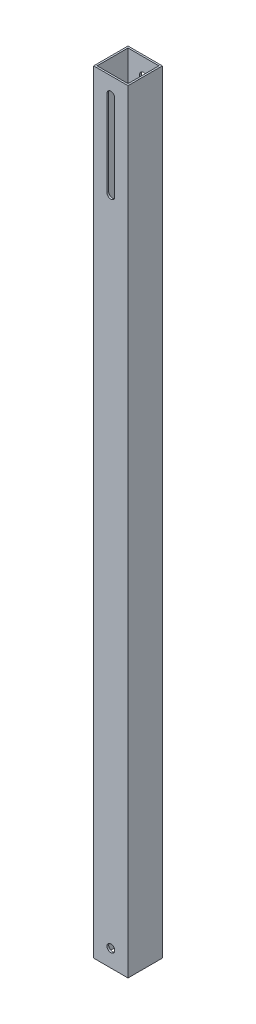
ISO-10303-21;
HEADER;
FILE_DESCRIPTION(('STEP AP214'),'2;1');
FILE_NAME('part.step','',(''),(''),'','','');
FILE_SCHEMA(('AUTOMOTIVE_DESIGN { 1 0 10303 214 1 1 1 1 }'));
ENDSEC;
DATA;
#1=APPLICATION_CONTEXT('core data for automotive mechanical design processes');
#2=APPLICATION_PROTOCOL_DEFINITION('international standard','automotive_design',2000,#1);
#3=PRODUCT_CONTEXT('',#1,'mechanical');
#4=PRODUCT('Part','Part','',(#3));
#5=PRODUCT_RELATED_PRODUCT_CATEGORY('part','',(#4));
#6=PRODUCT_DEFINITION_FORMATION('','',#4);
#7=PRODUCT_DEFINITION_CONTEXT('part definition',#1,'design');
#8=PRODUCT_DEFINITION('design','',#6,#7);
#9=PRODUCT_DEFINITION_SHAPE('','',#8);
#10=(LENGTH_UNIT() NAMED_UNIT(*) SI_UNIT(.MILLI.,.METRE.));
#11=(NAMED_UNIT(*) PLANE_ANGLE_UNIT() SI_UNIT($,.RADIAN.));
#12=(NAMED_UNIT(*) SI_UNIT($,.STERADIAN.) SOLID_ANGLE_UNIT());
#13=UNCERTAINTY_MEASURE_WITH_UNIT(LENGTH_MEASURE(1.E-05),#10,'distance_accuracy_value','');
#14=(GEOMETRIC_REPRESENTATION_CONTEXT(3) GLOBAL_UNCERTAINTY_ASSIGNED_CONTEXT((#13)) GLOBAL_UNIT_ASSIGNED_CONTEXT((#10,
#11,#12)) REPRESENTATION_CONTEXT('',''));
#15=CARTESIAN_POINT('',(0.,0.,0.));
#16=DIRECTION('',(0.,0.,1.));
#17=DIRECTION('',(1.,0.,0.));
#18=AXIS2_PLACEMENT_3D('',#15,#16,#17);
#19=CARTESIAN_POINT('',(0.,450.,0.));
#20=DIRECTION('',(0.,-1.,0.));
#21=DIRECTION('',(0.,0.,-1.));
#22=AXIS2_PLACEMENT_3D('',#19,#20,#21);
#23=PLANE('',#22);
#24=DIRECTION('',(0.,0.,-1.));
#25=VECTOR('',#24,1.);
#26=CARTESIAN_POINT('',(10.,450.,10.));
#27=LINE('',#26,#25);
#28=CARTESIAN_POINT('',(10.,450.,10.));
#29=VERTEX_POINT('',#28);
#30=CARTESIAN_POINT('',(10.,450.,-10.));
#31=VERTEX_POINT('',#30);
#32=EDGE_CURVE('E239',#29,#31,#27,.T.);
#33=ORIENTED_EDGE('',*,*,#32,.T.);
#34=DIRECTION('',(-1.,0.,0.));
#35=VECTOR('',#34,1.);
#36=CARTESIAN_POINT('',(-10.,450.,-10.));
#37=LINE('',#36,#35);
#38=CARTESIAN_POINT('',(-10.,450.,-10.));
#39=VERTEX_POINT('',#38);
#40=EDGE_CURVE('E242',#31,#39,#37,.T.);
#41=ORIENTED_EDGE('',*,*,#40,.T.);
#42=DIRECTION('',(0.,0.,1.));
#43=VECTOR('',#42,1.);
#44=CARTESIAN_POINT('',(-10.,450.,10.));
#45=LINE('',#44,#43);
#46=CARTESIAN_POINT('',(-10.,450.,10.));
#47=VERTEX_POINT('',#46);
#48=EDGE_CURVE('E245',#39,#47,#45,.T.);
#49=ORIENTED_EDGE('',*,*,#48,.T.);
#50=DIRECTION('',(1.,0.,0.));
#51=VECTOR('',#50,1.);
#52=CARTESIAN_POINT('',(-10.,450.,10.));
#53=LINE('',#52,#51);
#54=EDGE_CURVE('E247',#47,#29,#53,.T.);
#55=ORIENTED_EDGE('',*,*,#54,.T.);
#56=EDGE_LOOP('',(#33,#41,#49,#55));
#57=FACE_BOUND('',#56,.T.);
#58=DIRECTION('',(1.,0.,0.));
#59=VECTOR('',#58,1.);
#60=CARTESIAN_POINT('',(-9.,450.,9.));
#61=LINE('',#60,#59);
#62=CARTESIAN_POINT('',(-9.,450.,9.));
#63=VERTEX_POINT('',#62);
#64=CARTESIAN_POINT('',(9.,450.,9.));
#65=VERTEX_POINT('',#64);
#66=EDGE_CURVE('E208',#63,#65,#61,.T.);
#67=ORIENTED_EDGE('',*,*,#66,.F.);
#68=DIRECTION('',(0.,0.,1.));
#69=VECTOR('',#68,1.);
#70=CARTESIAN_POINT('',(-9.,450.,9.));
#71=LINE('',#70,#69);
#72=CARTESIAN_POINT('',(-9.,450.,-9.));
#73=VERTEX_POINT('',#72);
#74=EDGE_CURVE('E216',#73,#63,#71,.T.);
#75=ORIENTED_EDGE('',*,*,#74,.F.);
#76=DIRECTION('',(-1.,0.,0.));
#77=VECTOR('',#76,1.);
#78=CARTESIAN_POINT('',(-9.,450.,-9.));
#79=LINE('',#78,#77);
#80=CARTESIAN_POINT('',(9.,450.,-9.));
#81=VERTEX_POINT('',#80);
#82=EDGE_CURVE('E213',#81,#73,#79,.T.);
#83=ORIENTED_EDGE('',*,*,#82,.F.);
#84=DIRECTION('',(0.,0.,-1.));
#85=VECTOR('',#84,1.);
#86=CARTESIAN_POINT('',(9.,450.,9.));
#87=LINE('',#86,#85);
#88=EDGE_CURVE('E210',#65,#81,#87,.T.);
#89=ORIENTED_EDGE('',*,*,#88,.F.);
#90=EDGE_LOOP('',(#67,#75,#83,#89));
#91=FACE_BOUND('',#90,.T.);
#92=ADVANCED_FACE('F39',(#57,#91),#23,.F.);
#93=CARTESIAN_POINT('',(0.,0.,0.));
#94=DIRECTION('',(0.,-1.,0.));
#95=DIRECTION('',(0.,0.,-1.));
#96=AXIS2_PLACEMENT_3D('',#93,#94,#95);
#97=PLANE('',#96);
#98=DIRECTION('',(0.,0.,-1.));
#99=VECTOR('',#98,1.);
#100=CARTESIAN_POINT('',(10.,0.,10.));
#101=LINE('',#100,#99);
#102=CARTESIAN_POINT('',(10.,0.,10.));
#103=VERTEX_POINT('',#102);
#104=CARTESIAN_POINT('',(10.,0.,-10.));
#105=VERTEX_POINT('',#104);
#106=EDGE_CURVE('E238',#103,#105,#101,.T.);
#107=ORIENTED_EDGE('',*,*,#106,.F.);
#108=DIRECTION('',(1.,0.,0.));
#109=VECTOR('',#108,1.);
#110=CARTESIAN_POINT('',(-10.,0.,10.));
#111=LINE('',#110,#109);
#112=CARTESIAN_POINT('',(-10.,0.,10.));
#113=VERTEX_POINT('',#112);
#114=EDGE_CURVE('E243',#113,#103,#111,.T.);
#115=ORIENTED_EDGE('',*,*,#114,.F.);
#116=DIRECTION('',(0.,0.,1.));
#117=VECTOR('',#116,1.);
#118=CARTESIAN_POINT('',(-10.,0.,10.));
#119=LINE('',#118,#117);
#120=CARTESIAN_POINT('',(-10.,0.,-10.));
#121=VERTEX_POINT('',#120);
#122=EDGE_CURVE('E254',#121,#113,#119,.T.);
#123=ORIENTED_EDGE('',*,*,#122,.F.);
#124=DIRECTION('',(-1.,0.,0.));
#125=VECTOR('',#124,1.);
#126=CARTESIAN_POINT('',(-10.,0.,-10.));
#127=LINE('',#126,#125);
#128=EDGE_CURVE('E252',#105,#121,#127,.T.);
#129=ORIENTED_EDGE('',*,*,#128,.F.);
#130=EDGE_LOOP('',(#107,#115,#123,#129));
#131=FACE_BOUND('',#130,.T.);
#132=DIRECTION('',(0.,0.,1.));
#133=VECTOR('',#132,1.);
#134=CARTESIAN_POINT('',(-9.,0.,9.));
#135=LINE('',#134,#133);
#136=CARTESIAN_POINT('',(-9.,0.,-9.));
#137=VERTEX_POINT('',#136);
#138=CARTESIAN_POINT('',(-9.,0.,9.));
#139=VERTEX_POINT('',#138);
#140=EDGE_CURVE('E211',#137,#139,#135,.T.);
#141=ORIENTED_EDGE('',*,*,#140,.T.);
#142=DIRECTION('',(1.,0.,0.));
#143=VECTOR('',#142,1.);
#144=CARTESIAN_POINT('',(-9.,0.,9.));
#145=LINE('',#144,#143);
#146=CARTESIAN_POINT('',(9.,0.,9.));
#147=VERTEX_POINT('',#146);
#148=EDGE_CURVE('E207',#139,#147,#145,.T.);
#149=ORIENTED_EDGE('',*,*,#148,.T.);
#150=DIRECTION('',(0.,0.,-1.));
#151=VECTOR('',#150,1.);
#152=CARTESIAN_POINT('',(9.,0.,9.));
#153=LINE('',#152,#151);
#154=CARTESIAN_POINT('',(9.,0.,-9.));
#155=VERTEX_POINT('',#154);
#156=EDGE_CURVE('E221',#147,#155,#153,.T.);
#157=ORIENTED_EDGE('',*,*,#156,.T.);
#158=DIRECTION('',(-1.,0.,0.));
#159=VECTOR('',#158,1.);
#160=CARTESIAN_POINT('',(-9.,0.,-9.));
#161=LINE('',#160,#159);
#162=EDGE_CURVE('E224',#155,#137,#161,.T.);
#163=ORIENTED_EDGE('',*,*,#162,.T.);
#164=EDGE_LOOP('',(#141,#149,#157,#163));
#165=FACE_BOUND('',#164,.T.);
#166=ADVANCED_FACE('F319',(#131,#165),#97,.T.);
#167=CARTESIAN_POINT('',(10.,450.,10.));
#168=DIRECTION('',(-1.,0.,0.));
#169=DIRECTION('',(0.,0.,1.));
#170=AXIS2_PLACEMENT_3D('',#167,#168,#169);
#171=PLANE('',#170);
#172=ORIENTED_EDGE('',*,*,#106,.T.);
#173=DIRECTION('',(0.,-1.,0.));
#174=VECTOR('',#173,1.);
#175=CARTESIAN_POINT('',(10.,450.,-10.));
#176=LINE('',#175,#174);
#177=EDGE_CURVE('E265',#31,#105,#176,.T.);
#178=ORIENTED_EDGE('',*,*,#177,.F.);
#179=ORIENTED_EDGE('',*,*,#32,.F.);
#180=DIRECTION('',(0.,-1.,0.));
#181=VECTOR('',#180,1.);
#182=CARTESIAN_POINT('',(10.,450.,10.));
#183=LINE('',#182,#181);
#184=EDGE_CURVE('E249',#29,#103,#183,.T.);
#185=ORIENTED_EDGE('',*,*,#184,.T.);
#186=EDGE_LOOP('',(#172,#178,#179,#185));
#187=FACE_BOUND('',#186,.T.);
#188=ADVANCED_FACE('F41',(#187),#171,.F.);
#189=CARTESIAN_POINT('',(-10.,450.,-10.));
#190=DIRECTION('',(0.,0.,1.));
#191=DIRECTION('',(1.,0.,0.));
#192=AXIS2_PLACEMENT_3D('',#189,#190,#191);
#193=PLANE('',#192);
#194=CARTESIAN_POINT('',(0.,10.,-10.));
#195=DIRECTION('',(0.,0.,1.));
#196=DIRECTION('',(1.,0.,0.));
#197=AXIS2_PLACEMENT_3D('',#194,#195,#196);
#198=CIRCLE('',#197,2.25);
#199=CARTESIAN_POINT('',(2.25,10.,-10.));
#200=VERTEX_POINT('',#199);
#201=EDGE_CURVE('E181',#200,#200,#198,.T.);
#202=ORIENTED_EDGE('',*,*,#201,.T.);
#203=EDGE_LOOP('',(#202));
#204=FACE_BOUND('',#203,.T.);
#205=DIRECTION('',(0.,1.,0.));
#206=VECTOR('',#205,1.);
#207=CARTESIAN_POINT('',(2.24999999999999,440.,-10.));
#208=LINE('',#207,#206);
#209=CARTESIAN_POINT('',(2.25,390.,-10.));
#210=VERTEX_POINT('',#209);
#211=CARTESIAN_POINT('',(2.24999999999999,440.,-10.));
#212=VERTEX_POINT('',#211);
#213=EDGE_CURVE('E186',#210,#212,#208,.T.);
#214=ORIENTED_EDGE('',*,*,#213,.T.);
#215=CARTESIAN_POINT('',(0.,440.,-10.));
#216=DIRECTION('',(0.,0.,1.));
#217=DIRECTION('',(1.,0.,0.));
#218=AXIS2_PLACEMENT_3D('',#215,#216,#217);
#219=CIRCLE('',#218,2.25);
#220=CARTESIAN_POINT('',(-2.25000000000001,440.,-10.));
#221=VERTEX_POINT('',#220);
#222=EDGE_CURVE('E171',#212,#221,#219,.T.);
#223=ORIENTED_EDGE('',*,*,#222,.T.);
#224=DIRECTION('',(0.,-1.,0.));
#225=VECTOR('',#224,1.);
#226=CARTESIAN_POINT('',(-2.25000000000001,440.,-10.));
#227=LINE('',#226,#225);
#228=CARTESIAN_POINT('',(-2.25,390.,-10.));
#229=VERTEX_POINT('',#228);
#230=EDGE_CURVE('E191',#221,#229,#227,.T.);
#231=ORIENTED_EDGE('',*,*,#230,.T.);
#232=CARTESIAN_POINT('',(0.,390.,-10.));
#233=DIRECTION('',(0.,0.,1.));
#234=DIRECTION('',(1.,0.,0.));
#235=AXIS2_PLACEMENT_3D('',#232,#233,#234);
#236=CIRCLE('',#235,2.25);
#237=EDGE_CURVE('E55',#229,#210,#236,.T.);
#238=ORIENTED_EDGE('',*,*,#237,.T.);
#239=EDGE_LOOP('',(#214,#223,#231,#238));
#240=FACE_BOUND('',#239,.T.);
#241=ORIENTED_EDGE('',*,*,#128,.T.);
#242=DIRECTION('',(0.,-1.,0.));
#243=VECTOR('',#242,1.);
#244=CARTESIAN_POINT('',(-10.,450.,-10.));
#245=LINE('',#244,#243);
#246=EDGE_CURVE('E262',#39,#121,#245,.T.);
#247=ORIENTED_EDGE('',*,*,#246,.F.);
#248=ORIENTED_EDGE('',*,*,#40,.F.);
#249=ORIENTED_EDGE('',*,*,#177,.T.);
#250=EDGE_LOOP('',(#241,#247,#248,#249));
#251=FACE_BOUND('',#250,.T.);
#252=ADVANCED_FACE('F347',(#204,#240,#251),#193,.F.);
#253=CARTESIAN_POINT('',(-10.,450.,10.));
#254=DIRECTION('',(1.,0.,0.));
#255=DIRECTION('',(0.,0.,-1.));
#256=AXIS2_PLACEMENT_3D('',#253,#254,#255);
#257=PLANE('',#256);
#258=ORIENTED_EDGE('',*,*,#122,.T.);
#259=DIRECTION('',(0.,-1.,0.));
#260=VECTOR('',#259,1.);
#261=CARTESIAN_POINT('',(-10.,450.,10.));
#262=LINE('',#261,#260);
#263=EDGE_CURVE('E259',#47,#113,#262,.T.);
#264=ORIENTED_EDGE('',*,*,#263,.F.);
#265=ORIENTED_EDGE('',*,*,#48,.F.);
#266=ORIENTED_EDGE('',*,*,#246,.T.);
#267=EDGE_LOOP('',(#258,#264,#265,#266));
#268=FACE_BOUND('',#267,.T.);
#269=ADVANCED_FACE('F344',(#268),#257,.F.);
#270=CARTESIAN_POINT('',(-10.,450.,10.));
#271=DIRECTION('',(0.,0.,-1.));
#272=DIRECTION('',(-1.,0.,0.));
#273=AXIS2_PLACEMENT_3D('',#270,#271,#272);
#274=PLANE('',#273);
#275=CARTESIAN_POINT('',(0.,10.,10.));
#276=DIRECTION('',(0.,0.,1.));
#277=DIRECTION('',(1.,0.,0.));
#278=AXIS2_PLACEMENT_3D('',#275,#276,#277);
#279=CIRCLE('',#278,2.25);
#280=CARTESIAN_POINT('',(2.25,10.,10.));
#281=VERTEX_POINT('',#280);
#282=EDGE_CURVE('E178',#281,#281,#279,.T.);
#283=ORIENTED_EDGE('',*,*,#282,.F.);
#284=EDGE_LOOP('',(#283));
#285=FACE_BOUND('',#284,.T.);
#286=DIRECTION('',(0.,-1.,0.));
#287=VECTOR('',#286,1.);
#288=CARTESIAN_POINT('',(-2.25000000000001,440.,10.));
#289=LINE('',#288,#287);
#290=CARTESIAN_POINT('',(-2.25000000000001,440.,10.));
#291=VERTEX_POINT('',#290);
#292=CARTESIAN_POINT('',(-2.25,390.,10.));
#293=VERTEX_POINT('',#292);
#294=EDGE_CURVE('E177',#291,#293,#289,.T.);
#295=ORIENTED_EDGE('',*,*,#294,.F.);
#296=CARTESIAN_POINT('',(0.,440.,10.));
#297=DIRECTION('',(0.,0.,1.));
#298=DIRECTION('',(1.,0.,0.));
#299=AXIS2_PLACEMENT_3D('',#296,#297,#298);
#300=CIRCLE('',#299,2.25);
#301=CARTESIAN_POINT('',(2.24999999999999,440.,10.));
#302=VERTEX_POINT('',#301);
#303=EDGE_CURVE('E63',#302,#291,#300,.T.);
#304=ORIENTED_EDGE('',*,*,#303,.F.);
#305=DIRECTION('',(0.,1.,0.));
#306=VECTOR('',#305,1.);
#307=CARTESIAN_POINT('',(2.24999999999999,440.,10.));
#308=LINE('',#307,#306);
#309=CARTESIAN_POINT('',(2.25,390.,10.));
#310=VERTEX_POINT('',#309);
#311=EDGE_CURVE('E163',#310,#302,#308,.T.);
#312=ORIENTED_EDGE('',*,*,#311,.F.);
#313=CARTESIAN_POINT('',(0.,390.,10.));
#314=DIRECTION('',(0.,0.,1.));
#315=DIRECTION('',(1.,0.,0.));
#316=AXIS2_PLACEMENT_3D('',#313,#314,#315);
#317=CIRCLE('',#316,2.25);
#318=EDGE_CURVE('E170',#293,#310,#317,.T.);
#319=ORIENTED_EDGE('',*,*,#318,.F.);
#320=EDGE_LOOP('',(#295,#304,#312,#319));
#321=FACE_BOUND('',#320,.T.);
#322=ORIENTED_EDGE('',*,*,#114,.T.);
#323=ORIENTED_EDGE('',*,*,#184,.F.);
#324=ORIENTED_EDGE('',*,*,#54,.F.);
#325=ORIENTED_EDGE('',*,*,#263,.T.);
#326=EDGE_LOOP('',(#322,#323,#324,#325));
#327=FACE_BOUND('',#326,.T.);
#328=ADVANCED_FACE('F174',(#285,#321,#327),#274,.F.);
#329=CARTESIAN_POINT('',(-9.,450.,9.));
#330=DIRECTION('',(0.,0.,-1.));
#331=DIRECTION('',(-1.,0.,0.));
#332=AXIS2_PLACEMENT_3D('',#329,#330,#331);
#333=PLANE('',#332);
#334=CARTESIAN_POINT('',(0.,10.,9.));
#335=DIRECTION('',(0.,0.,-1.));
#336=DIRECTION('',(-1.,0.,0.));
#337=AXIS2_PLACEMENT_3D('',#334,#335,#336);
#338=CIRCLE('',#337,2.25);
#339=CARTESIAN_POINT('',(-2.25,10.,9.));
#340=VERTEX_POINT('',#339);
#341=EDGE_CURVE('E204',#340,#340,#338,.T.);
#342=ORIENTED_EDGE('',*,*,#341,.F.);
#343=EDGE_LOOP('',(#342));
#344=FACE_BOUND('',#343,.T.);
#345=CARTESIAN_POINT('',(0.,440.,9.));
#346=DIRECTION('',(0.,0.,-1.));
#347=DIRECTION('',(-1.,0.,0.));
#348=AXIS2_PLACEMENT_3D('',#345,#346,#347);
#349=CIRCLE('',#348,2.25);
#350=CARTESIAN_POINT('',(-2.25000000000001,440.,9.));
#351=VERTEX_POINT('',#350);
#352=CARTESIAN_POINT('',(2.24999999999999,440.,9.));
#353=VERTEX_POINT('',#352);
#354=EDGE_CURVE('E157',#351,#353,#349,.T.);
#355=ORIENTED_EDGE('',*,*,#354,.F.);
#356=DIRECTION('',(0.,1.,0.));
#357=VECTOR('',#356,1.);
#358=CARTESIAN_POINT('',(-2.25000000000001,450.,9.));
#359=LINE('',#358,#357);
#360=CARTESIAN_POINT('',(-2.25,390.,9.));
#361=VERTEX_POINT('',#360);
#362=EDGE_CURVE('E196',#361,#351,#359,.T.);
#363=ORIENTED_EDGE('',*,*,#362,.F.);
#364=CARTESIAN_POINT('',(0.,390.,9.));
#365=DIRECTION('',(0.,0.,-1.));
#366=DIRECTION('',(-1.,0.,0.));
#367=AXIS2_PLACEMENT_3D('',#364,#365,#366);
#368=CIRCLE('',#367,2.25);
#369=CARTESIAN_POINT('',(2.25,390.,9.));
#370=VERTEX_POINT('',#369);
#371=EDGE_CURVE('E198',#370,#361,#368,.T.);
#372=ORIENTED_EDGE('',*,*,#371,.F.);
#373=DIRECTION('',(0.,-1.,0.));
#374=VECTOR('',#373,1.);
#375=CARTESIAN_POINT('',(2.24999999999999,450.,9.));
#376=LINE('',#375,#374);
#377=EDGE_CURVE('E201',#353,#370,#376,.T.);
#378=ORIENTED_EDGE('',*,*,#377,.F.);
#379=EDGE_LOOP('',(#355,#363,#372,#378));
#380=FACE_BOUND('',#379,.T.);
#381=ORIENTED_EDGE('',*,*,#148,.F.);
#382=DIRECTION('',(0.,-1.,0.));
#383=VECTOR('',#382,1.);
#384=CARTESIAN_POINT('',(-9.,450.,9.));
#385=LINE('',#384,#383);
#386=EDGE_CURVE('E218',#63,#139,#385,.T.);
#387=ORIENTED_EDGE('',*,*,#386,.F.);
#388=ORIENTED_EDGE('',*,*,#66,.T.);
#389=DIRECTION('',(0.,-1.,0.));
#390=VECTOR('',#389,1.);
#391=CARTESIAN_POINT('',(9.,450.,9.));
#392=LINE('',#391,#390);
#393=EDGE_CURVE('E235',#65,#147,#392,.T.);
#394=ORIENTED_EDGE('',*,*,#393,.T.);
#395=EDGE_LOOP('',(#381,#387,#388,#394));
#396=FACE_BOUND('',#395,.T.);
#397=ADVANCED_FACE('F305',(#344,#380,#396),#333,.T.);
#398=CARTESIAN_POINT('',(9.,450.,9.));
#399=DIRECTION('',(-1.,0.,0.));
#400=DIRECTION('',(0.,0.,1.));
#401=AXIS2_PLACEMENT_3D('',#398,#399,#400);
#402=PLANE('',#401);
#403=ORIENTED_EDGE('',*,*,#156,.F.);
#404=ORIENTED_EDGE('',*,*,#393,.F.);
#405=ORIENTED_EDGE('',*,*,#88,.T.);
#406=DIRECTION('',(0.,-1.,0.));
#407=VECTOR('',#406,1.);
#408=CARTESIAN_POINT('',(9.,450.,-9.));
#409=LINE('',#408,#407);
#410=EDGE_CURVE('E233',#81,#155,#409,.T.);
#411=ORIENTED_EDGE('',*,*,#410,.T.);
#412=EDGE_LOOP('',(#403,#404,#405,#411));
#413=FACE_BOUND('',#412,.T.);
#414=ADVANCED_FACE('F308',(#413),#402,.T.);
#415=CARTESIAN_POINT('',(-9.,450.,-9.));
#416=DIRECTION('',(0.,0.,1.));
#417=DIRECTION('',(1.,0.,0.));
#418=AXIS2_PLACEMENT_3D('',#415,#416,#417);
#419=PLANE('',#418);
#420=CARTESIAN_POINT('',(0.,10.,-9.));
#421=DIRECTION('',(0.,0.,1.));
#422=DIRECTION('',(1.,0.,0.));
#423=AXIS2_PLACEMENT_3D('',#420,#421,#422);
#424=CIRCLE('',#423,2.25);
#425=CARTESIAN_POINT('',(2.25,10.,-9.));
#426=VERTEX_POINT('',#425);
#427=EDGE_CURVE('E43',#426,#426,#424,.T.);
#428=ORIENTED_EDGE('',*,*,#427,.F.);
#429=EDGE_LOOP('',(#428));
#430=FACE_BOUND('',#429,.T.);
#431=CARTESIAN_POINT('',(0.,440.,-9.));
#432=DIRECTION('',(0.,0.,1.));
#433=DIRECTION('',(1.,0.,0.));
#434=AXIS2_PLACEMENT_3D('',#431,#432,#433);
#435=CIRCLE('',#434,2.25);
#436=CARTESIAN_POINT('',(2.24999999999999,440.,-9.));
#437=VERTEX_POINT('',#436);
#438=CARTESIAN_POINT('',(-2.25000000000001,440.,-9.));
#439=VERTEX_POINT('',#438);
#440=EDGE_CURVE('E11',#437,#439,#435,.T.);
#441=ORIENTED_EDGE('',*,*,#440,.F.);
#442=DIRECTION('',(0.,1.,0.));
#443=VECTOR('',#442,1.);
#444=CARTESIAN_POINT('',(2.24999999999999,450.,-9.));
#445=LINE('',#444,#443);
#446=CARTESIAN_POINT('',(2.25,390.,-9.));
#447=VERTEX_POINT('',#446);
#448=EDGE_CURVE('E48',#447,#437,#445,.T.);
#449=ORIENTED_EDGE('',*,*,#448,.F.);
#450=CARTESIAN_POINT('',(0.,390.,-9.));
#451=DIRECTION('',(0.,0.,1.));
#452=DIRECTION('',(1.,0.,0.));
#453=AXIS2_PLACEMENT_3D('',#450,#451,#452);
#454=CIRCLE('',#453,2.25);
#455=CARTESIAN_POINT('',(-2.25,390.,-9.));
#456=VERTEX_POINT('',#455);
#457=EDGE_CURVE('E270',#456,#447,#454,.T.);
#458=ORIENTED_EDGE('',*,*,#457,.F.);
#459=DIRECTION('',(0.,-1.,0.));
#460=VECTOR('',#459,1.);
#461=CARTESIAN_POINT('',(-2.25000000000001,450.,-9.));
#462=LINE('',#461,#460);
#463=EDGE_CURVE('E268',#439,#456,#462,.T.);
#464=ORIENTED_EDGE('',*,*,#463,.F.);
#465=EDGE_LOOP('',(#441,#449,#458,#464));
#466=FACE_BOUND('',#465,.T.);
#467=ORIENTED_EDGE('',*,*,#162,.F.);
#468=ORIENTED_EDGE('',*,*,#410,.F.);
#469=ORIENTED_EDGE('',*,*,#82,.T.);
#470=DIRECTION('',(0.,-1.,0.));
#471=VECTOR('',#470,1.);
#472=CARTESIAN_POINT('',(-9.,450.,-9.));
#473=LINE('',#472,#471);
#474=EDGE_CURVE('E231',#73,#137,#473,.T.);
#475=ORIENTED_EDGE('',*,*,#474,.T.);
#476=EDGE_LOOP('',(#467,#468,#469,#475));
#477=FACE_BOUND('',#476,.T.);
#478=ADVANCED_FACE('F286',(#430,#466,#477),#419,.T.);
#479=CARTESIAN_POINT('',(-9.,450.,9.));
#480=DIRECTION('',(1.,0.,0.));
#481=DIRECTION('',(0.,0.,-1.));
#482=AXIS2_PLACEMENT_3D('',#479,#480,#481);
#483=PLANE('',#482);
#484=ORIENTED_EDGE('',*,*,#140,.F.);
#485=ORIENTED_EDGE('',*,*,#474,.F.);
#486=ORIENTED_EDGE('',*,*,#74,.T.);
#487=ORIENTED_EDGE('',*,*,#386,.T.);
#488=EDGE_LOOP('',(#484,#485,#486,#487));
#489=FACE_BOUND('',#488,.T.);
#490=ADVANCED_FACE('F317',(#489),#483,.T.);
#491=CARTESIAN_POINT('',(-2.25000000000001,440.,-10.));
#492=DIRECTION('',(-1.,0.,0.));
#493=DIRECTION('',(0.,-1.,0.));
#494=AXIS2_PLACEMENT_3D('',#491,#492,#493);
#495=PLANE('',#494);
#496=ORIENTED_EDGE('',*,*,#463,.T.);
#497=DIRECTION('',(0.,0.,1.));
#498=VECTOR('',#497,1.);
#499=CARTESIAN_POINT('',(-2.25,390.,-10.));
#500=LINE('',#499,#498);
#501=EDGE_CURVE('E291',#229,#456,#500,.T.);
#502=ORIENTED_EDGE('',*,*,#501,.F.);
#503=ORIENTED_EDGE('',*,*,#230,.F.);
#504=DIRECTION('',(0.,0.,1.));
#505=VECTOR('',#504,1.);
#506=CARTESIAN_POINT('',(-2.25000000000001,440.,-10.));
#507=LINE('',#506,#505);
#508=EDGE_CURVE('E189',#221,#439,#507,.T.);
#509=ORIENTED_EDGE('',*,*,#508,.T.);
#510=EDGE_LOOP('',(#496,#502,#503,#509));
#511=FACE_BOUND('',#510,.T.);
#512=ADVANCED_FACE('F289',(#511),#495,.F.);
#513=CARTESIAN_POINT('',(0.,390.,-10.));
#514=DIRECTION('',(0.,0.,1.));
#515=DIRECTION('',(1.,0.,0.));
#516=AXIS2_PLACEMENT_3D('',#513,#514,#515);
#517=CYLINDRICAL_SURFACE('',#516,2.25);
#518=ORIENTED_EDGE('',*,*,#457,.T.);
#519=DIRECTION('',(0.,0.,1.));
#520=VECTOR('',#519,1.);
#521=CARTESIAN_POINT('',(2.25,390.,-10.));
#522=LINE('',#521,#520);
#523=EDGE_CURVE('E279',#210,#447,#522,.T.);
#524=ORIENTED_EDGE('',*,*,#523,.F.);
#525=ORIENTED_EDGE('',*,*,#237,.F.);
#526=ORIENTED_EDGE('',*,*,#501,.T.);
#527=EDGE_LOOP('',(#518,#524,#525,#526));
#528=FACE_BOUND('',#527,.T.);
#529=ADVANCED_FACE('F292',(#528),#517,.F.);
#530=CARTESIAN_POINT('',(2.24999999999999,440.,-10.));
#531=DIRECTION('',(1.,0.,0.));
#532=DIRECTION('',(0.,1.,0.));
#533=AXIS2_PLACEMENT_3D('',#530,#531,#532);
#534=PLANE('',#533);
#535=ORIENTED_EDGE('',*,*,#448,.T.);
#536=DIRECTION('',(0.,0.,1.));
#537=VECTOR('',#536,1.);
#538=CARTESIAN_POINT('',(2.24999999999999,440.,-10.));
#539=LINE('',#538,#537);
#540=EDGE_CURVE('E160',#212,#437,#539,.T.);
#541=ORIENTED_EDGE('',*,*,#540,.F.);
#542=ORIENTED_EDGE('',*,*,#213,.F.);
#543=ORIENTED_EDGE('',*,*,#523,.T.);
#544=EDGE_LOOP('',(#535,#541,#542,#543));
#545=FACE_BOUND('',#544,.T.);
#546=ADVANCED_FACE('F276',(#545),#534,.F.);
#547=CARTESIAN_POINT('',(0.,440.,-10.));
#548=DIRECTION('',(0.,0.,1.));
#549=DIRECTION('',(1.,0.,0.));
#550=AXIS2_PLACEMENT_3D('',#547,#548,#549);
#551=CYLINDRICAL_SURFACE('',#550,2.25);
#552=ORIENTED_EDGE('',*,*,#440,.T.);
#553=ORIENTED_EDGE('',*,*,#508,.F.);
#554=ORIENTED_EDGE('',*,*,#222,.F.);
#555=ORIENTED_EDGE('',*,*,#540,.T.);
#556=EDGE_LOOP('',(#552,#553,#554,#555));
#557=FACE_BOUND('',#556,.T.);
#558=ADVANCED_FACE('F284',(#557),#551,.F.);
#559=CARTESIAN_POINT('',(0.,10.,-10.));
#560=DIRECTION('',(0.,0.,1.));
#561=DIRECTION('',(1.,0.,0.));
#562=AXIS2_PLACEMENT_3D('',#559,#560,#561);
#563=CYLINDRICAL_SURFACE('',#562,2.25);
#564=ORIENTED_EDGE('',*,*,#427,.T.);
#565=EDGE_LOOP('',(#564));
#566=FACE_BOUND('',#565,.T.);
#567=ORIENTED_EDGE('',*,*,#201,.F.);
#568=EDGE_LOOP('',(#567));
#569=FACE_BOUND('',#568,.T.);
#570=ADVANCED_FACE('F371',(#566,#569),#563,.F.);
#571=ORIENTED_EDGE('',*,*,#354,.T.);
#572=EDGE_CURVE('E153',#353,#302,#539,.T.);
#573=ORIENTED_EDGE('',*,*,#572,.T.);
#574=ORIENTED_EDGE('',*,*,#303,.T.);
#575=EDGE_CURVE('E293',#351,#291,#507,.T.);
#576=ORIENTED_EDGE('',*,*,#575,.F.);
#577=EDGE_LOOP('',(#571,#573,#574,#576));
#578=FACE_BOUND('',#577,.T.);
#579=ADVANCED_FACE('F155',(#578),#551,.F.);
#580=ORIENTED_EDGE('',*,*,#377,.T.);
#581=EDGE_CURVE('E166',#370,#310,#522,.T.);
#582=ORIENTED_EDGE('',*,*,#581,.T.);
#583=ORIENTED_EDGE('',*,*,#311,.T.);
#584=ORIENTED_EDGE('',*,*,#572,.F.);
#585=EDGE_LOOP('',(#580,#582,#583,#584));
#586=FACE_BOUND('',#585,.T.);
#587=ADVANCED_FACE('F164',(#586),#534,.F.);
#588=ORIENTED_EDGE('',*,*,#371,.T.);
#589=EDGE_CURVE('E294',#361,#293,#500,.T.);
#590=ORIENTED_EDGE('',*,*,#589,.T.);
#591=ORIENTED_EDGE('',*,*,#318,.T.);
#592=ORIENTED_EDGE('',*,*,#581,.F.);
#593=EDGE_LOOP('',(#588,#590,#591,#592));
#594=FACE_BOUND('',#593,.T.);
#595=ADVANCED_FACE('F299',(#594),#517,.F.);
#596=ORIENTED_EDGE('',*,*,#362,.T.);
#597=ORIENTED_EDGE('',*,*,#575,.T.);
#598=ORIENTED_EDGE('',*,*,#294,.T.);
#599=ORIENTED_EDGE('',*,*,#589,.F.);
#600=EDGE_LOOP('',(#596,#597,#598,#599));
#601=FACE_BOUND('',#600,.T.);
#602=ADVANCED_FACE('F303',(#601),#495,.F.);
#603=ORIENTED_EDGE('',*,*,#341,.T.);
#604=EDGE_LOOP('',(#603));
#605=FACE_BOUND('',#604,.T.);
#606=ORIENTED_EDGE('',*,*,#282,.T.);
#607=EDGE_LOOP('',(#606));
#608=FACE_BOUND('',#607,.T.);
#609=ADVANCED_FACE('F375',(#605,#608),#563,.F.);
#610=CLOSED_SHELL('',(#92,#166,#188,#252,#269,#328,#397,#414,#478,#490,#512,#529,#546,#558,#570,
#579,#587,#595,#602,#609));
#611=MANIFOLD_SOLID_BREP('B2',#610);
#612=ADVANCED_BREP_SHAPE_REPRESENTATION('',(#18,#611),#14);
#613=SHAPE_DEFINITION_REPRESENTATION(#9,#612);
ENDSEC;
END-ISO-10303-21;
